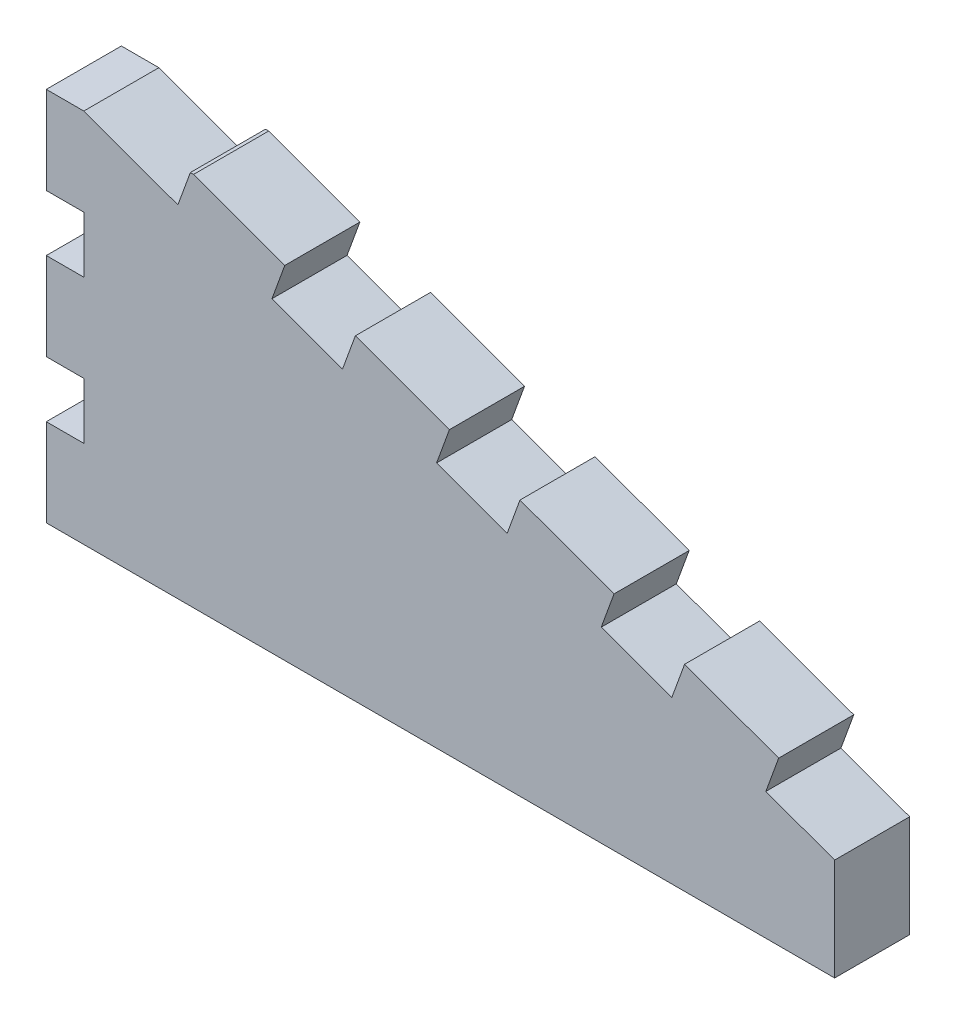
ISO-10303-21;
HEADER;
FILE_DESCRIPTION(('STEP AP214'),'2;1');
FILE_NAME('part.step','',(''),(''),'','','');
FILE_SCHEMA(('AUTOMOTIVE_DESIGN { 1 0 10303 214 1 1 1 1 }'));
ENDSEC;
DATA;
#1=APPLICATION_CONTEXT('core data for automotive mechanical design processes');
#2=APPLICATION_PROTOCOL_DEFINITION('international standard','automotive_design',2000,#1);
#3=PRODUCT_CONTEXT('',#1,'mechanical');
#4=PRODUCT('Part','Part','',(#3));
#5=PRODUCT_RELATED_PRODUCT_CATEGORY('part','',(#4));
#6=PRODUCT_DEFINITION_FORMATION('','',#4);
#7=PRODUCT_DEFINITION_CONTEXT('part definition',#1,'design');
#8=PRODUCT_DEFINITION('design','',#6,#7);
#9=PRODUCT_DEFINITION_SHAPE('','',#8);
#10=(LENGTH_UNIT() NAMED_UNIT(*) SI_UNIT(.MILLI.,.METRE.));
#11=(NAMED_UNIT(*) PLANE_ANGLE_UNIT() SI_UNIT($,.RADIAN.));
#12=(NAMED_UNIT(*) SI_UNIT($,.STERADIAN.) SOLID_ANGLE_UNIT());
#13=UNCERTAINTY_MEASURE_WITH_UNIT(LENGTH_MEASURE(1.E-05),#10,'distance_accuracy_value','');
#14=(GEOMETRIC_REPRESENTATION_CONTEXT(3) GLOBAL_UNCERTAINTY_ASSIGNED_CONTEXT((#13)) GLOBAL_UNIT_ASSIGNED_CONTEXT((#10,
#11,#12)) REPRESENTATION_CONTEXT('',''));
#15=CARTESIAN_POINT('',(0.,0.,0.));
#16=DIRECTION('',(0.,0.,1.));
#17=DIRECTION('',(1.,0.,0.));
#18=AXIS2_PLACEMENT_3D('',#15,#16,#17);
#19=CARTESIAN_POINT('',(0.,30.,6.));
#20=DIRECTION('',(0.,-1.,0.));
#21=DIRECTION('',(0.,0.,-1.));
#22=AXIS2_PLACEMENT_3D('',#19,#20,#21);
#23=PLANE('',#22);
#24=DIRECTION('',(-1.,0.,0.));
#25=VECTOR('',#24,1.);
#26=CARTESIAN_POINT('',(0.,30.,0.));
#27=LINE('',#26,#25);
#28=CARTESIAN_POINT('',(-60.,30.,0.));
#29=VERTEX_POINT('',#28);
#30=CARTESIAN_POINT('',(-63.,30.,0.));
#31=VERTEX_POINT('',#30);
#32=EDGE_CURVE('E267',#29,#31,#27,.T.);
#33=ORIENTED_EDGE('',*,*,#32,.T.);
#34=DIRECTION('',(0.,0.,-1.));
#35=VECTOR('',#34,1.);
#36=CARTESIAN_POINT('',(-63.,30.,6.));
#37=LINE('',#36,#35);
#38=CARTESIAN_POINT('',(-63.,30.,6.));
#39=VERTEX_POINT('',#38);
#40=EDGE_CURVE('E11',#39,#31,#37,.T.);
#41=ORIENTED_EDGE('',*,*,#40,.F.);
#42=DIRECTION('',(-1.,0.,0.));
#43=VECTOR('',#42,1.);
#44=CARTESIAN_POINT('',(0.,30.,6.));
#45=LINE('',#44,#43);
#46=CARTESIAN_POINT('',(-60.,30.,6.));
#47=VERTEX_POINT('',#46);
#48=EDGE_CURVE('E417',#47,#39,#45,.T.);
#49=ORIENTED_EDGE('',*,*,#48,.F.);
#50=DIRECTION('',(0.,0.,-1.));
#51=VECTOR('',#50,1.);
#52=CARTESIAN_POINT('',(-60.,30.,6.));
#53=LINE('',#52,#51);
#54=EDGE_CURVE('E53',#47,#29,#53,.T.);
#55=ORIENTED_EDGE('',*,*,#54,.T.);
#56=EDGE_LOOP('',(#33,#41,#49,#55));
#57=FACE_BOUND('',#56,.T.);
#58=ADVANCED_FACE('F37',(#57),#23,.F.);
#59=CARTESIAN_POINT('',(-63.,-1.2490009027033E-13,6.));
#60=DIRECTION('',(1.,0.,0.));
#61=DIRECTION('',(0.,1.,0.));
#62=AXIS2_PLACEMENT_3D('',#59,#60,#61);
#63=PLANE('',#62);
#64=DIRECTION('',(0.,-1.,0.));
#65=VECTOR('',#64,1.);
#66=CARTESIAN_POINT('',(-63.,-1.2490009027033E-13,0.));
#67=LINE('',#66,#65);
#68=CARTESIAN_POINT('',(-63.,23.,0.));
#69=VERTEX_POINT('',#68);
#70=EDGE_CURVE('E269',#31,#69,#67,.T.);
#71=ORIENTED_EDGE('',*,*,#70,.T.);
#72=DIRECTION('',(0.,0.,-1.));
#73=VECTOR('',#72,1.);
#74=CARTESIAN_POINT('',(-63.,23.,6.));
#75=LINE('',#74,#73);
#76=CARTESIAN_POINT('',(-63.,23.,6.));
#77=VERTEX_POINT('',#76);
#78=EDGE_CURVE('E45',#77,#69,#75,.T.);
#79=ORIENTED_EDGE('',*,*,#78,.F.);
#80=DIRECTION('',(0.,-1.,0.));
#81=VECTOR('',#80,1.);
#82=CARTESIAN_POINT('',(-63.,-1.2490009027033E-13,6.));
#83=LINE('',#82,#81);
#84=EDGE_CURVE('E157',#39,#77,#83,.T.);
#85=ORIENTED_EDGE('',*,*,#84,.F.);
#86=ORIENTED_EDGE('',*,*,#40,.T.);
#87=EDGE_LOOP('',(#71,#79,#85,#86));
#88=FACE_BOUND('',#87,.T.);
#89=ADVANCED_FACE('F399',(#88),#63,.F.);
#90=CARTESIAN_POINT('',(0.,23.,6.));
#91=DIRECTION('',(0.,-1.,0.));
#92=DIRECTION('',(0.,0.,-1.));
#93=AXIS2_PLACEMENT_3D('',#90,#91,#92);
#94=PLANE('',#93);
#95=DIRECTION('',(-1.,0.,0.));
#96=VECTOR('',#95,1.);
#97=CARTESIAN_POINT('',(0.,23.,0.));
#98=LINE('',#97,#96);
#99=CARTESIAN_POINT('',(-60.,23.,0.));
#100=VERTEX_POINT('',#99);
#101=EDGE_CURVE('E272',#100,#69,#98,.T.);
#102=ORIENTED_EDGE('',*,*,#101,.F.);
#103=DIRECTION('',(0.,0.,-1.));
#104=VECTOR('',#103,1.);
#105=CARTESIAN_POINT('',(-60.,23.,6.));
#106=LINE('',#105,#104);
#107=CARTESIAN_POINT('',(-60.,23.,6.));
#108=VERTEX_POINT('',#107);
#109=EDGE_CURVE('E392',#108,#100,#106,.T.);
#110=ORIENTED_EDGE('',*,*,#109,.F.);
#111=DIRECTION('',(-1.,0.,0.));
#112=VECTOR('',#111,1.);
#113=CARTESIAN_POINT('',(0.,23.,6.));
#114=LINE('',#113,#112);
#115=EDGE_CURVE('E398',#108,#77,#114,.T.);
#116=ORIENTED_EDGE('',*,*,#115,.T.);
#117=ORIENTED_EDGE('',*,*,#78,.T.);
#118=EDGE_LOOP('',(#102,#110,#116,#117));
#119=FACE_BOUND('',#118,.T.);
#120=ADVANCED_FACE('F396',(#119),#94,.T.);
#121=CARTESIAN_POINT('',(-60.,0.,6.));
#122=DIRECTION('',(-1.,0.,0.));
#123=DIRECTION('',(0.,0.,1.));
#124=AXIS2_PLACEMENT_3D('',#121,#122,#123);
#125=PLANE('',#124);
#126=DIRECTION('',(0.,1.,0.));
#127=VECTOR('',#126,1.);
#128=CARTESIAN_POINT('',(-60.,0.,0.));
#129=LINE('',#128,#127);
#130=CARTESIAN_POINT('',(-60.,18.5,0.));
#131=VERTEX_POINT('',#130);
#132=EDGE_CURVE('E275',#131,#100,#129,.T.);
#133=ORIENTED_EDGE('',*,*,#132,.F.);
#134=DIRECTION('',(0.,0.,-1.));
#135=VECTOR('',#134,1.);
#136=CARTESIAN_POINT('',(-60.,18.5,6.));
#137=LINE('',#136,#135);
#138=CARTESIAN_POINT('',(-60.,18.5,6.));
#139=VERTEX_POINT('',#138);
#140=EDGE_CURVE('E390',#139,#131,#137,.T.);
#141=ORIENTED_EDGE('',*,*,#140,.F.);
#142=DIRECTION('',(0.,1.,0.));
#143=VECTOR('',#142,1.);
#144=CARTESIAN_POINT('',(-60.,0.,6.));
#145=LINE('',#144,#143);
#146=EDGE_CURVE('E410',#139,#108,#145,.T.);
#147=ORIENTED_EDGE('',*,*,#146,.T.);
#148=ORIENTED_EDGE('',*,*,#109,.T.);
#149=EDGE_LOOP('',(#133,#141,#147,#148));
#150=FACE_BOUND('',#149,.T.);
#151=ADVANCED_FACE('F407',(#150),#125,.T.);
#152=CARTESIAN_POINT('',(0.,18.5,6.));
#153=DIRECTION('',(0.,1.,0.));
#154=DIRECTION('',(0.,0.,1.));
#155=AXIS2_PLACEMENT_3D('',#152,#153,#154);
#156=PLANE('',#155);
#157=DIRECTION('',(1.,0.,0.));
#158=VECTOR('',#157,1.);
#159=CARTESIAN_POINT('',(0.,18.5,0.));
#160=LINE('',#159,#158);
#161=CARTESIAN_POINT('',(-63.,18.5,0.));
#162=VERTEX_POINT('',#161);
#163=EDGE_CURVE('E278',#162,#131,#160,.T.);
#164=ORIENTED_EDGE('',*,*,#163,.F.);
#165=DIRECTION('',(0.,0.,-1.));
#166=VECTOR('',#165,1.);
#167=CARTESIAN_POINT('',(-63.,18.5,6.));
#168=LINE('',#167,#166);
#169=CARTESIAN_POINT('',(-63.,18.5,6.));
#170=VERTEX_POINT('',#169);
#171=EDGE_CURVE('E388',#170,#162,#168,.T.);
#172=ORIENTED_EDGE('',*,*,#171,.F.);
#173=DIRECTION('',(1.,0.,0.));
#174=VECTOR('',#173,1.);
#175=CARTESIAN_POINT('',(0.,18.5,6.));
#176=LINE('',#175,#174);
#177=EDGE_CURVE('E414',#170,#139,#176,.T.);
#178=ORIENTED_EDGE('',*,*,#177,.T.);
#179=ORIENTED_EDGE('',*,*,#140,.T.);
#180=EDGE_LOOP('',(#164,#172,#178,#179));
#181=FACE_BOUND('',#180,.T.);
#182=ADVANCED_FACE('F530',(#181),#156,.T.);
#183=CARTESIAN_POINT('',(-63.,0.,6.));
#184=DIRECTION('',(1.,0.,0.));
#185=DIRECTION('',(0.,0.,-1.));
#186=AXIS2_PLACEMENT_3D('',#183,#184,#185);
#187=PLANE('',#186);
#188=DIRECTION('',(0.,-1.,0.));
#189=VECTOR('',#188,1.);
#190=CARTESIAN_POINT('',(-63.,0.,0.));
#191=LINE('',#190,#189);
#192=CARTESIAN_POINT('',(-63.,11.5,0.));
#193=VERTEX_POINT('',#192);
#194=EDGE_CURVE('E282',#162,#193,#191,.T.);
#195=ORIENTED_EDGE('',*,*,#194,.T.);
#196=DIRECTION('',(0.,0.,-1.));
#197=VECTOR('',#196,1.);
#198=CARTESIAN_POINT('',(-63.,11.5,6.));
#199=LINE('',#198,#197);
#200=CARTESIAN_POINT('',(-63.,11.5,6.));
#201=VERTEX_POINT('',#200);
#202=EDGE_CURVE('E386',#201,#193,#199,.T.);
#203=ORIENTED_EDGE('',*,*,#202,.F.);
#204=DIRECTION('',(0.,-1.,0.));
#205=VECTOR('',#204,1.);
#206=CARTESIAN_POINT('',(-63.,0.,6.));
#207=LINE('',#206,#205);
#208=EDGE_CURVE('E422',#170,#201,#207,.T.);
#209=ORIENTED_EDGE('',*,*,#208,.F.);
#210=ORIENTED_EDGE('',*,*,#171,.T.);
#211=EDGE_LOOP('',(#195,#203,#209,#210));
#212=FACE_BOUND('',#211,.T.);
#213=ADVANCED_FACE('F532',(#212),#187,.F.);
#214=CARTESIAN_POINT('',(0.,11.5,6.));
#215=DIRECTION('',(0.,-1.,0.));
#216=DIRECTION('',(1.,0.,0.));
#217=AXIS2_PLACEMENT_3D('',#214,#215,#216);
#218=PLANE('',#217);
#219=DIRECTION('',(-1.,0.,0.));
#220=VECTOR('',#219,1.);
#221=CARTESIAN_POINT('',(0.,11.5,0.));
#222=LINE('',#221,#220);
#223=CARTESIAN_POINT('',(-60.,11.5,0.));
#224=VERTEX_POINT('',#223);
#225=EDGE_CURVE('E285',#224,#193,#222,.T.);
#226=ORIENTED_EDGE('',*,*,#225,.F.);
#227=DIRECTION('',(0.,0.,-1.));
#228=VECTOR('',#227,1.);
#229=CARTESIAN_POINT('',(-60.,11.5,6.));
#230=LINE('',#229,#228);
#231=CARTESIAN_POINT('',(-60.,11.5,6.));
#232=VERTEX_POINT('',#231);
#233=EDGE_CURVE('E384',#232,#224,#230,.T.);
#234=ORIENTED_EDGE('',*,*,#233,.F.);
#235=DIRECTION('',(-1.,0.,0.));
#236=VECTOR('',#235,1.);
#237=CARTESIAN_POINT('',(0.,11.5,6.));
#238=LINE('',#237,#236);
#239=EDGE_CURVE('E424',#232,#201,#238,.T.);
#240=ORIENTED_EDGE('',*,*,#239,.T.);
#241=ORIENTED_EDGE('',*,*,#202,.T.);
#242=EDGE_LOOP('',(#226,#234,#240,#241));
#243=FACE_BOUND('',#242,.T.);
#244=ADVANCED_FACE('F526',(#243),#218,.T.);
#245=CARTESIAN_POINT('',(-60.,6.99999999999999,0.));
#246=VERTEX_POINT('',#245);
#247=EDGE_CURVE('E279',#246,#224,#129,.T.);
#248=ORIENTED_EDGE('',*,*,#247,.F.);
#249=DIRECTION('',(0.,0.,-1.));
#250=VECTOR('',#249,1.);
#251=CARTESIAN_POINT('',(-60.,6.99999999999999,6.));
#252=LINE('',#251,#250);
#253=CARTESIAN_POINT('',(-60.,6.99999999999999,6.));
#254=VERTEX_POINT('',#253);
#255=EDGE_CURVE('E382',#254,#246,#252,.T.);
#256=ORIENTED_EDGE('',*,*,#255,.F.);
#257=EDGE_CURVE('E416',#254,#232,#145,.T.);
#258=ORIENTED_EDGE('',*,*,#257,.T.);
#259=ORIENTED_EDGE('',*,*,#233,.T.);
#260=EDGE_LOOP('',(#248,#256,#258,#259));
#261=FACE_BOUND('',#260,.T.);
#262=ADVANCED_FACE('F519',(#261),#125,.T.);
#263=CARTESIAN_POINT('',(0.,7.00000000000001,6.));
#264=DIRECTION('',(0.,-1.,0.));
#265=DIRECTION('',(1.,0.,0.));
#266=AXIS2_PLACEMENT_3D('',#263,#264,#265);
#267=PLANE('',#266);
#268=DIRECTION('',(-1.,0.,0.));
#269=VECTOR('',#268,1.);
#270=CARTESIAN_POINT('',(0.,7.00000000000001,0.));
#271=LINE('',#270,#269);
#272=CARTESIAN_POINT('',(-63.,6.99999999999999,0.));
#273=VERTEX_POINT('',#272);
#274=EDGE_CURVE('E288',#246,#273,#271,.T.);
#275=ORIENTED_EDGE('',*,*,#274,.T.);
#276=DIRECTION('',(0.,0.,-1.));
#277=VECTOR('',#276,1.);
#278=CARTESIAN_POINT('',(-63.,6.99999999999999,6.));
#279=LINE('',#278,#277);
#280=CARTESIAN_POINT('',(-63.,6.99999999999999,6.));
#281=VERTEX_POINT('',#280);
#282=EDGE_CURVE('E380',#281,#273,#279,.T.);
#283=ORIENTED_EDGE('',*,*,#282,.F.);
#284=DIRECTION('',(-1.,0.,0.));
#285=VECTOR('',#284,1.);
#286=CARTESIAN_POINT('',(0.,7.00000000000001,6.));
#287=LINE('',#286,#285);
#288=EDGE_CURVE('E427',#254,#281,#287,.T.);
#289=ORIENTED_EDGE('',*,*,#288,.F.);
#290=ORIENTED_EDGE('',*,*,#255,.T.);
#291=EDGE_LOOP('',(#275,#283,#289,#290));
#292=FACE_BOUND('',#291,.T.);
#293=ADVANCED_FACE('F608',(#292),#267,.F.);
#294=CARTESIAN_POINT('',(-63.,0.,6.));
#295=DIRECTION('',(-1.,0.,0.));
#296=DIRECTION('',(0.,0.,1.));
#297=AXIS2_PLACEMENT_3D('',#294,#295,#296);
#298=PLANE('',#297);
#299=DIRECTION('',(0.,1.,0.));
#300=VECTOR('',#299,1.);
#301=CARTESIAN_POINT('',(-63.,0.,0.));
#302=LINE('',#301,#300);
#303=CARTESIAN_POINT('',(-63.,0.,0.));
#304=VERTEX_POINT('',#303);
#305=EDGE_CURVE('E291',#304,#273,#302,.T.);
#306=ORIENTED_EDGE('',*,*,#305,.F.);
#307=DIRECTION('',(0.,0.,-1.));
#308=VECTOR('',#307,1.);
#309=CARTESIAN_POINT('',(-63.,0.,6.));
#310=LINE('',#309,#308);
#311=CARTESIAN_POINT('',(-63.,0.,6.));
#312=VERTEX_POINT('',#311);
#313=EDGE_CURVE('E378',#312,#304,#310,.T.);
#314=ORIENTED_EDGE('',*,*,#313,.F.);
#315=DIRECTION('',(0.,1.,0.));
#316=VECTOR('',#315,1.);
#317=CARTESIAN_POINT('',(-63.,0.,6.));
#318=LINE('',#317,#316);
#319=EDGE_CURVE('E429',#312,#281,#318,.T.);
#320=ORIENTED_EDGE('',*,*,#319,.T.);
#321=ORIENTED_EDGE('',*,*,#282,.T.);
#322=EDGE_LOOP('',(#306,#314,#320,#321));
#323=FACE_BOUND('',#322,.T.);
#324=ADVANCED_FACE('F512',(#323),#298,.T.);
#325=CARTESIAN_POINT('',(0.,0.,6.));
#326=DIRECTION('',(0.,-1.,0.));
#327=DIRECTION('',(1.,0.,0.));
#328=AXIS2_PLACEMENT_3D('',#325,#326,#327);
#329=PLANE('',#328);
#330=DIRECTION('',(-1.,0.,0.));
#331=VECTOR('',#330,1.);
#332=CARTESIAN_POINT('',(0.,0.,0.));
#333=LINE('',#332,#331);
#334=CARTESIAN_POINT('',(0.,0.,0.));
#335=VERTEX_POINT('',#334);
#336=EDGE_CURVE('E294',#335,#304,#333,.T.);
#337=ORIENTED_EDGE('',*,*,#336,.F.);
#338=DIRECTION('',(0.,0.,-1.));
#339=VECTOR('',#338,1.);
#340=CARTESIAN_POINT('',(0.,0.,6.));
#341=LINE('',#340,#339);
#342=CARTESIAN_POINT('',(0.,0.,6.));
#343=VERTEX_POINT('',#342);
#344=EDGE_CURVE('E376',#343,#335,#341,.T.);
#345=ORIENTED_EDGE('',*,*,#344,.F.);
#346=DIRECTION('',(-1.,0.,0.));
#347=VECTOR('',#346,1.);
#348=CARTESIAN_POINT('',(0.,0.,6.));
#349=LINE('',#348,#347);
#350=EDGE_CURVE('E432',#343,#312,#349,.T.);
#351=ORIENTED_EDGE('',*,*,#350,.T.);
#352=ORIENTED_EDGE('',*,*,#313,.T.);
#353=EDGE_LOOP('',(#337,#345,#351,#352));
#354=FACE_BOUND('',#353,.T.);
#355=ADVANCED_FACE('F507',(#354),#329,.T.);
#356=CARTESIAN_POINT('',(0.,0.,6.));
#357=DIRECTION('',(-1.,0.,0.));
#358=DIRECTION('',(0.,0.,1.));
#359=AXIS2_PLACEMENT_3D('',#356,#357,#358);
#360=PLANE('',#359);
#361=DIRECTION('',(0.,1.,0.));
#362=VECTOR('',#361,1.);
#363=CARTESIAN_POINT('',(0.,0.,0.));
#364=LINE('',#363,#362);
#365=CARTESIAN_POINT('',(0.,8.16178594402829,0.));
#366=VERTEX_POINT('',#365);
#367=EDGE_CURVE('E297',#335,#366,#364,.T.);
#368=ORIENTED_EDGE('',*,*,#367,.T.);
#369=DIRECTION('',(0.,0.,-1.));
#370=VECTOR('',#369,1.);
#371=CARTESIAN_POINT('',(0.,8.16178594402829,6.));
#372=LINE('',#371,#370);
#373=CARTESIAN_POINT('',(0.,8.16178594402829,6.));
#374=VERTEX_POINT('',#373);
#375=EDGE_CURVE('E374',#374,#366,#372,.T.);
#376=ORIENTED_EDGE('',*,*,#375,.F.);
#377=DIRECTION('',(0.,1.,0.));
#378=VECTOR('',#377,1.);
#379=CARTESIAN_POINT('',(0.,0.,6.));
#380=LINE('',#379,#378);
#381=EDGE_CURVE('E435',#343,#374,#380,.T.);
#382=ORIENTED_EDGE('',*,*,#381,.F.);
#383=ORIENTED_EDGE('',*,*,#344,.T.);
#384=EDGE_LOOP('',(#368,#376,#382,#383));
#385=FACE_BOUND('',#384,.T.);
#386=ADVANCED_FACE('F504',(#385),#360,.F.);
#387=CARTESIAN_POINT('',(2.62314743886753,7.2070383561889,6.));
#388=DIRECTION('',(0.342020143325663,0.939692620785911,0.));
#389=DIRECTION('',(-0.939692620785911,0.342020143325663,0.));
#390=AXIS2_PLACEMENT_3D('',#387,#388,#389);
#391=PLANE('',#390);
#392=DIRECTION('',(0.939692620785911,-0.342020143325663,0.));
#393=VECTOR('',#392,1.);
#394=CARTESIAN_POINT('',(2.62314743886753,7.2070383561889,0.));
#395=LINE('',#394,#393);
#396=CARTESIAN_POINT('',(-5.49782799441718,10.1628316871116,0.));
#397=VERTEX_POINT('',#396);
#398=EDGE_CURVE('E300',#397,#366,#395,.T.);
#399=ORIENTED_EDGE('',*,*,#398,.F.);
#400=DIRECTION('',(0.,0.,-1.));
#401=VECTOR('',#400,1.);
#402=CARTESIAN_POINT('',(-5.49782799441718,10.1628316871116,6.));
#403=LINE('',#402,#401);
#404=CARTESIAN_POINT('',(-5.49782799441718,10.1628316871116,6.));
#405=VERTEX_POINT('',#404);
#406=EDGE_CURVE('E372',#405,#397,#403,.T.);
#407=ORIENTED_EDGE('',*,*,#406,.F.);
#408=DIRECTION('',(0.939692620785911,-0.342020143325663,0.));
#409=VECTOR('',#408,1.);
#410=CARTESIAN_POINT('',(2.62314743886753,7.2070383561889,6.));
#411=LINE('',#410,#409);
#412=EDGE_CURVE('E264',#405,#374,#411,.T.);
#413=ORIENTED_EDGE('',*,*,#412,.T.);
#414=ORIENTED_EDGE('',*,*,#375,.T.);
#415=EDGE_LOOP('',(#399,#407,#413,#414));
#416=FACE_BOUND('',#415,.T.);
#417=ADVANCED_FACE('F498',(#416),#391,.T.);
#418=CARTESIAN_POINT('',(-8.12097543328471,2.95579333092265,6.));
#419=DIRECTION('',(-0.939692620785911,0.342020143325663,0.));
#420=DIRECTION('',(-0.342020143325663,-0.939692620785911,0.));
#421=AXIS2_PLACEMENT_3D('',#418,#419,#420);
#422=PLANE('',#421);
#423=DIRECTION('',(0.342020143325663,0.939692620785911,0.));
#424=VECTOR('',#423,1.);
#425=CARTESIAN_POINT('',(-8.12097543328471,2.95579333092265,0.));
#426=LINE('',#425,#424);
#427=CARTESIAN_POINT('',(-4.47176756444019,12.9819095494693,0.));
#428=VERTEX_POINT('',#427);
#429=EDGE_CURVE('E303',#397,#428,#426,.T.);
#430=ORIENTED_EDGE('',*,*,#429,.T.);
#431=DIRECTION('',(0.,0.,-1.));
#432=VECTOR('',#431,1.);
#433=CARTESIAN_POINT('',(-4.47176756444019,12.9819095494693,6.));
#434=LINE('',#433,#432);
#435=CARTESIAN_POINT('',(-4.47176756444019,12.9819095494693,6.));
#436=VERTEX_POINT('',#435);
#437=EDGE_CURVE('E370',#436,#428,#434,.T.);
#438=ORIENTED_EDGE('',*,*,#437,.F.);
#439=DIRECTION('',(0.342020143325663,0.939692620785911,0.));
#440=VECTOR('',#439,1.);
#441=CARTESIAN_POINT('',(-8.12097543328471,2.95579333092265,6.));
#442=LINE('',#441,#440);
#443=EDGE_CURVE('E438',#405,#436,#442,.T.);
#444=ORIENTED_EDGE('',*,*,#443,.F.);
#445=ORIENTED_EDGE('',*,*,#406,.T.);
#446=EDGE_LOOP('',(#430,#438,#444,#445));
#447=FACE_BOUND('',#446,.T.);
#448=ADVANCED_FACE('F557',(#447),#422,.F.);
#449=CARTESIAN_POINT('',(3.64920786884452,10.0261162185466,6.));
#450=DIRECTION('',(0.342020143325663,0.93969262078591,0.));
#451=DIRECTION('',(-0.939692620785911,0.342020143325663,0.));
#452=AXIS2_PLACEMENT_3D('',#449,#450,#451);
#453=PLANE('',#452);
#454=DIRECTION('',(0.939692620785911,-0.342020143325663,0.));
#455=VECTOR('',#454,1.);
#456=CARTESIAN_POINT('',(3.64920786884452,10.0261162185466,0.));
#457=LINE('',#456,#455);
#458=CARTESIAN_POINT('',(-11.9893085307275,15.7180706960746,0.));
#459=VERTEX_POINT('',#458);
#460=EDGE_CURVE('E308',#459,#428,#457,.T.);
#461=ORIENTED_EDGE('',*,*,#460,.F.);
#462=DIRECTION('',(0.,0.,-1.));
#463=VECTOR('',#462,1.);
#464=CARTESIAN_POINT('',(-11.9893085307275,15.7180706960746,6.));
#465=LINE('',#464,#463);
#466=CARTESIAN_POINT('',(-11.9893085307275,15.7180706960746,6.));
#467=VERTEX_POINT('',#466);
#468=EDGE_CURVE('E368',#467,#459,#465,.T.);
#469=ORIENTED_EDGE('',*,*,#468,.F.);
#470=DIRECTION('',(0.939692620785911,-0.342020143325663,0.));
#471=VECTOR('',#470,1.);
#472=CARTESIAN_POINT('',(3.64920786884452,10.0261162185466,6.));
#473=LINE('',#472,#471);
#474=EDGE_CURVE('E441',#467,#436,#473,.T.);
#475=ORIENTED_EDGE('',*,*,#474,.T.);
#476=ORIENTED_EDGE('',*,*,#437,.T.);
#477=EDGE_LOOP('',(#461,#469,#475,#476));
#478=FACE_BOUND('',#477,.T.);
#479=ADVANCED_FACE('F491',(#478),#453,.T.);
#480=CARTESIAN_POINT('',(-15.638516399572,5.69195447752794,6.));
#481=DIRECTION('',(-0.939692620785911,0.342020143325662,0.));
#482=DIRECTION('',(-0.342020143325662,-0.939692620785911,0.));
#483=AXIS2_PLACEMENT_3D('',#480,#481,#482);
#484=PLANE('',#483);
#485=DIRECTION('',(0.342020143325662,0.939692620785911,0.));
#486=VECTOR('',#485,1.);
#487=CARTESIAN_POINT('',(-15.638516399572,5.69195447752794,0.));
#488=LINE('',#487,#486);
#489=CARTESIAN_POINT('',(-13.0153689607045,12.8989928337169,0.));
#490=VERTEX_POINT('',#489);
#491=EDGE_CURVE('E311',#490,#459,#488,.T.);
#492=ORIENTED_EDGE('',*,*,#491,.F.);
#493=DIRECTION('',(0.,0.,-1.));
#494=VECTOR('',#493,1.);
#495=CARTESIAN_POINT('',(-13.0153689607045,12.8989928337169,6.));
#496=LINE('',#495,#494);
#497=CARTESIAN_POINT('',(-13.0153689607045,12.8989928337169,6.));
#498=VERTEX_POINT('',#497);
#499=EDGE_CURVE('E366',#498,#490,#496,.T.);
#500=ORIENTED_EDGE('',*,*,#499,.F.);
#501=DIRECTION('',(0.342020143325662,0.939692620785911,0.));
#502=VECTOR('',#501,1.);
#503=CARTESIAN_POINT('',(-15.638516399572,5.69195447752794,6.));
#504=LINE('',#503,#502);
#505=EDGE_CURVE('E444',#498,#467,#504,.T.);
#506=ORIENTED_EDGE('',*,*,#505,.T.);
#507=ORIENTED_EDGE('',*,*,#468,.T.);
#508=EDGE_LOOP('',(#492,#500,#506,#507));
#509=FACE_BOUND('',#508,.T.);
#510=ADVANCED_FACE('F487',(#509),#484,.T.);
#511=CARTESIAN_POINT('',(-18.6535246854199,14.9511136936708,0.));
#512=VERTEX_POINT('',#511);
#513=EDGE_CURVE('E305',#512,#490,#395,.T.);
#514=ORIENTED_EDGE('',*,*,#513,.F.);
#515=DIRECTION('',(0.,0.,-1.));
#516=VECTOR('',#515,1.);
#517=CARTESIAN_POINT('',(-18.6535246854199,14.9511136936708,6.));
#518=LINE('',#517,#516);
#519=CARTESIAN_POINT('',(-18.6535246854199,14.9511136936708,6.));
#520=VERTEX_POINT('',#519);
#521=EDGE_CURVE('E364',#520,#512,#518,.T.);
#522=ORIENTED_EDGE('',*,*,#521,.F.);
#523=EDGE_CURVE('E439',#520,#498,#411,.T.);
#524=ORIENTED_EDGE('',*,*,#523,.T.);
#525=ORIENTED_EDGE('',*,*,#499,.T.);
#526=EDGE_LOOP('',(#514,#522,#524,#525));
#527=FACE_BOUND('',#526,.T.);
#528=ADVANCED_FACE('F481',(#527),#391,.T.);
#529=CARTESIAN_POINT('',(-21.2766721242875,7.74407533748193,6.));
#530=DIRECTION('',(-0.939692620785911,0.342020143325663,0.));
#531=DIRECTION('',(-0.342020143325663,-0.939692620785911,0.));
#532=AXIS2_PLACEMENT_3D('',#529,#530,#531);
#533=PLANE('',#532);
#534=DIRECTION('',(0.342020143325663,0.939692620785911,0.));
#535=VECTOR('',#534,1.);
#536=CARTESIAN_POINT('',(-21.2766721242875,7.74407533748193,0.));
#537=LINE('',#536,#535);
#538=CARTESIAN_POINT('',(-17.6274642554429,17.7701915560286,0.));
#539=VERTEX_POINT('',#538);
#540=EDGE_CURVE('E314',#512,#539,#537,.T.);
#541=ORIENTED_EDGE('',*,*,#540,.T.);
#542=DIRECTION('',(0.,0.,-1.));
#543=VECTOR('',#542,1.);
#544=CARTESIAN_POINT('',(-17.6274642554429,17.7701915560286,6.));
#545=LINE('',#544,#543);
#546=CARTESIAN_POINT('',(-17.6274642554429,17.7701915560286,6.));
#547=VERTEX_POINT('',#546);
#548=EDGE_CURVE('E362',#547,#539,#545,.T.);
#549=ORIENTED_EDGE('',*,*,#548,.F.);
#550=DIRECTION('',(0.342020143325663,0.939692620785911,0.));
#551=VECTOR('',#550,1.);
#552=CARTESIAN_POINT('',(-21.2766721242875,7.74407533748193,6.));
#553=LINE('',#552,#551);
#554=EDGE_CURVE('E447',#520,#547,#553,.T.);
#555=ORIENTED_EDGE('',*,*,#554,.F.);
#556=ORIENTED_EDGE('',*,*,#521,.T.);
#557=EDGE_LOOP('',(#541,#549,#555,#556));
#558=FACE_BOUND('',#557,.T.);
#559=ADVANCED_FACE('F586',(#558),#533,.F.);
#560=CARTESIAN_POINT('',(3.64920786884452,10.0261162185467,6.));
#561=DIRECTION('',(0.342020143325662,0.939692620785911,0.));
#562=DIRECTION('',(-0.939692620785911,0.342020143325662,0.));
#563=AXIS2_PLACEMENT_3D('',#560,#561,#562);
#564=PLANE('',#563);
#565=DIRECTION('',(0.939692620785911,-0.342020143325662,0.));
#566=VECTOR('',#565,1.);
#567=CARTESIAN_POINT('',(3.64920786884452,10.0261162185467,0.));
#568=LINE('',#567,#566);
#569=CARTESIAN_POINT('',(-25.1450052217302,20.5063527026339,0.));
#570=VERTEX_POINT('',#569);
#571=EDGE_CURVE('E317',#570,#539,#568,.T.);
#572=ORIENTED_EDGE('',*,*,#571,.F.);
#573=DIRECTION('',(0.,0.,-1.));
#574=VECTOR('',#573,1.);
#575=CARTESIAN_POINT('',(-25.1450052217302,20.5063527026339,6.));
#576=LINE('',#575,#574);
#577=CARTESIAN_POINT('',(-25.1450052217302,20.5063527026339,6.));
#578=VERTEX_POINT('',#577);
#579=EDGE_CURVE('E360',#578,#570,#576,.T.);
#580=ORIENTED_EDGE('',*,*,#579,.F.);
#581=DIRECTION('',(0.939692620785911,-0.342020143325662,0.));
#582=VECTOR('',#581,1.);
#583=CARTESIAN_POINT('',(3.64920786884452,10.0261162185467,6.));
#584=LINE('',#583,#582);
#585=EDGE_CURVE('E449',#578,#547,#584,.T.);
#586=ORIENTED_EDGE('',*,*,#585,.T.);
#587=ORIENTED_EDGE('',*,*,#548,.T.);
#588=EDGE_LOOP('',(#572,#580,#586,#587));
#589=FACE_BOUND('',#588,.T.);
#590=ADVANCED_FACE('F582',(#589),#564,.T.);
#591=CARTESIAN_POINT('',(-28.7942130905747,10.4802364840872,6.));
#592=DIRECTION('',(-0.939692620785911,0.342020143325662,0.));
#593=DIRECTION('',(-0.342020143325662,-0.939692620785911,0.));
#594=AXIS2_PLACEMENT_3D('',#591,#592,#593);
#595=PLANE('',#594);
#596=DIRECTION('',(0.342020143325662,0.939692620785911,0.));
#597=VECTOR('',#596,1.);
#598=CARTESIAN_POINT('',(-28.7942130905747,10.4802364840872,0.));
#599=LINE('',#598,#597);
#600=CARTESIAN_POINT('',(-26.1710656517072,17.6872748402761,0.));
#601=VERTEX_POINT('',#600);
#602=EDGE_CURVE('E320',#601,#570,#599,.T.);
#603=ORIENTED_EDGE('',*,*,#602,.F.);
#604=DIRECTION('',(0.,0.,-1.));
#605=VECTOR('',#604,1.);
#606=CARTESIAN_POINT('',(-26.1710656517072,17.6872748402761,6.));
#607=LINE('',#606,#605);
#608=CARTESIAN_POINT('',(-26.1710656517072,17.6872748402761,6.));
#609=VERTEX_POINT('',#608);
#610=EDGE_CURVE('E358',#609,#601,#607,.T.);
#611=ORIENTED_EDGE('',*,*,#610,.F.);
#612=DIRECTION('',(0.342020143325662,0.939692620785911,0.));
#613=VECTOR('',#612,1.);
#614=CARTESIAN_POINT('',(-28.7942130905747,10.4802364840872,6.));
#615=LINE('',#614,#613);
#616=EDGE_CURVE('E452',#609,#578,#615,.T.);
#617=ORIENTED_EDGE('',*,*,#616,.T.);
#618=ORIENTED_EDGE('',*,*,#579,.T.);
#619=EDGE_LOOP('',(#603,#611,#617,#618));
#620=FACE_BOUND('',#619,.T.);
#621=ADVANCED_FACE('F574',(#620),#595,.T.);
#622=CARTESIAN_POINT('',(-31.8092213764227,19.7393957002301,0.));
#623=VERTEX_POINT('',#622);
#624=EDGE_CURVE('E323',#623,#601,#395,.T.);
#625=ORIENTED_EDGE('',*,*,#624,.F.);
#626=DIRECTION('',(0.,0.,-1.));
#627=VECTOR('',#626,1.);
#628=CARTESIAN_POINT('',(-31.8092213764227,19.7393957002301,6.));
#629=LINE('',#628,#627);
#630=CARTESIAN_POINT('',(-31.8092213764227,19.7393957002301,6.));
#631=VERTEX_POINT('',#630);
#632=EDGE_CURVE('E356',#631,#623,#629,.T.);
#633=ORIENTED_EDGE('',*,*,#632,.F.);
#634=EDGE_CURVE('E455',#631,#609,#411,.T.);
#635=ORIENTED_EDGE('',*,*,#634,.T.);
#636=ORIENTED_EDGE('',*,*,#610,.T.);
#637=EDGE_LOOP('',(#625,#633,#635,#636));
#638=FACE_BOUND('',#637,.T.);
#639=ADVANCED_FACE('F562',(#638),#391,.T.);
#640=CARTESIAN_POINT('',(-34.4323688152902,12.5323573440412,6.));
#641=DIRECTION('',(-0.939692620785911,0.342020143325663,0.));
#642=DIRECTION('',(-0.342020143325663,-0.939692620785911,0.));
#643=AXIS2_PLACEMENT_3D('',#640,#641,#642);
#644=PLANE('',#643);
#645=DIRECTION('',(0.342020143325662,0.939692620785911,0.));
#646=VECTOR('',#645,1.);
#647=CARTESIAN_POINT('',(-34.4323688152902,12.5323573440412,0.));
#648=LINE('',#647,#646);
#649=CARTESIAN_POINT('',(-30.7831609464457,22.5584735625878,0.));
#650=VERTEX_POINT('',#649);
#651=EDGE_CURVE('E324',#623,#650,#648,.T.);
#652=ORIENTED_EDGE('',*,*,#651,.T.);
#653=DIRECTION('',(0.,0.,-1.));
#654=VECTOR('',#653,1.);
#655=CARTESIAN_POINT('',(-30.7831609464457,22.5584735625878,6.));
#656=LINE('',#655,#654);
#657=CARTESIAN_POINT('',(-30.7831609464457,22.5584735625878,6.));
#658=VERTEX_POINT('',#657);
#659=EDGE_CURVE('E354',#658,#650,#656,.T.);
#660=ORIENTED_EDGE('',*,*,#659,.F.);
#661=DIRECTION('',(0.342020143325662,0.939692620785911,0.));
#662=VECTOR('',#661,1.);
#663=CARTESIAN_POINT('',(-34.4323688152902,12.5323573440412,6.));
#664=LINE('',#663,#662);
#665=EDGE_CURVE('E456',#631,#658,#664,.T.);
#666=ORIENTED_EDGE('',*,*,#665,.F.);
#667=ORIENTED_EDGE('',*,*,#632,.T.);
#668=EDGE_LOOP('',(#652,#660,#666,#667));
#669=FACE_BOUND('',#668,.T.);
#670=ADVANCED_FACE('F573',(#669),#644,.F.);
#671=CARTESIAN_POINT('',(3.64920786884451,10.0261162185466,6.));
#672=DIRECTION('',(0.342020143325663,0.93969262078591,0.));
#673=DIRECTION('',(-0.93969262078591,0.342020143325663,0.));
#674=AXIS2_PLACEMENT_3D('',#671,#672,#673);
#675=PLANE('',#674);
#676=DIRECTION('',(0.939692620785911,-0.342020143325663,0.));
#677=VECTOR('',#676,1.);
#678=CARTESIAN_POINT('',(3.64920786884451,10.0261162185466,0.));
#679=LINE('',#678,#677);
#680=CARTESIAN_POINT('',(-38.300701912733,25.2946347091931,0.));
#681=VERTEX_POINT('',#680);
#682=EDGE_CURVE('E327',#681,#650,#679,.T.);
#683=ORIENTED_EDGE('',*,*,#682,.F.);
#684=DIRECTION('',(0.,0.,-1.));
#685=VECTOR('',#684,1.);
#686=CARTESIAN_POINT('',(-38.300701912733,25.2946347091931,6.));
#687=LINE('',#686,#685);
#688=CARTESIAN_POINT('',(-38.300701912733,25.2946347091931,6.));
#689=VERTEX_POINT('',#688);
#690=EDGE_CURVE('E352',#689,#681,#687,.T.);
#691=ORIENTED_EDGE('',*,*,#690,.F.);
#692=DIRECTION('',(0.939692620785911,-0.342020143325663,0.));
#693=VECTOR('',#692,1.);
#694=CARTESIAN_POINT('',(3.64920786884451,10.0261162185466,6.));
#695=LINE('',#694,#693);
#696=EDGE_CURVE('E458',#689,#658,#695,.T.);
#697=ORIENTED_EDGE('',*,*,#696,.T.);
#698=ORIENTED_EDGE('',*,*,#659,.T.);
#699=EDGE_LOOP('',(#683,#691,#697,#698));
#700=FACE_BOUND('',#699,.T.);
#701=ADVANCED_FACE('F569',(#700),#675,.T.);
#702=CARTESIAN_POINT('',(-41.9499097815775,15.2685184906465,6.));
#703=DIRECTION('',(-0.939692620785911,0.342020143325662,0.));
#704=DIRECTION('',(-0.342020143325662,-0.939692620785911,0.));
#705=AXIS2_PLACEMENT_3D('',#702,#703,#704);
#706=PLANE('',#705);
#707=DIRECTION('',(0.342020143325662,0.939692620785911,0.));
#708=VECTOR('',#707,1.);
#709=CARTESIAN_POINT('',(-41.9499097815775,15.2685184906465,0.));
#710=LINE('',#709,#708);
#711=CARTESIAN_POINT('',(-39.32676234271,22.4755568468354,0.));
#712=VERTEX_POINT('',#711);
#713=EDGE_CURVE('E330',#712,#681,#710,.T.);
#714=ORIENTED_EDGE('',*,*,#713,.F.);
#715=DIRECTION('',(0.,0.,-1.));
#716=VECTOR('',#715,1.);
#717=CARTESIAN_POINT('',(-39.32676234271,22.4755568468354,6.));
#718=LINE('',#717,#716);
#719=CARTESIAN_POINT('',(-39.32676234271,22.4755568468354,6.));
#720=VERTEX_POINT('',#719);
#721=EDGE_CURVE('E350',#720,#712,#718,.T.);
#722=ORIENTED_EDGE('',*,*,#721,.F.);
#723=DIRECTION('',(0.342020143325662,0.939692620785911,0.));
#724=VECTOR('',#723,1.);
#725=CARTESIAN_POINT('',(-41.9499097815775,15.2685184906465,6.));
#726=LINE('',#725,#724);
#727=EDGE_CURVE('E461',#720,#689,#726,.T.);
#728=ORIENTED_EDGE('',*,*,#727,.T.);
#729=ORIENTED_EDGE('',*,*,#690,.T.);
#730=EDGE_LOOP('',(#714,#722,#728,#729));
#731=FACE_BOUND('',#730,.T.);
#732=ADVANCED_FACE('F560',(#731),#706,.T.);
#733=CARTESIAN_POINT('',(-44.9649180674254,24.5276777067894,0.));
#734=VERTEX_POINT('',#733);
#735=EDGE_CURVE('E333',#734,#712,#395,.T.);
#736=ORIENTED_EDGE('',*,*,#735,.F.);
#737=DIRECTION('',(0.,0.,-1.));
#738=VECTOR('',#737,1.);
#739=CARTESIAN_POINT('',(-44.9649180674254,24.5276777067894,6.));
#740=LINE('',#739,#738);
#741=CARTESIAN_POINT('',(-44.9649180674254,24.5276777067894,6.));
#742=VERTEX_POINT('',#741);
#743=EDGE_CURVE('E348',#742,#734,#740,.T.);
#744=ORIENTED_EDGE('',*,*,#743,.F.);
#745=EDGE_CURVE('E263',#742,#720,#411,.T.);
#746=ORIENTED_EDGE('',*,*,#745,.T.);
#747=ORIENTED_EDGE('',*,*,#721,.T.);
#748=EDGE_LOOP('',(#736,#744,#746,#747));
#749=FACE_BOUND('',#748,.T.);
#750=ADVANCED_FACE('F548',(#749),#391,.T.);
#751=CARTESIAN_POINT('',(-47.5880655062929,17.3206393506006,6.));
#752=DIRECTION('',(-0.93969262078591,0.342020143325664,0.));
#753=DIRECTION('',(-0.342020143325664,-0.93969262078591,0.));
#754=AXIS2_PLACEMENT_3D('',#751,#752,#753);
#755=PLANE('',#754);
#756=DIRECTION('',(0.342020143325664,0.93969262078591,0.));
#757=VECTOR('',#756,1.);
#758=CARTESIAN_POINT('',(-47.5880655062929,17.3206393506006,0.));
#759=LINE('',#758,#757);
#760=CARTESIAN_POINT('',(-43.9388576374484,27.3467555691471,0.));
#761=VERTEX_POINT('',#760);
#762=EDGE_CURVE('E334',#734,#761,#759,.T.);
#763=ORIENTED_EDGE('',*,*,#762,.T.);
#764=DIRECTION('',(0.,0.,-1.));
#765=VECTOR('',#764,1.);
#766=CARTESIAN_POINT('',(-43.9388576374484,27.3467555691471,6.));
#767=LINE('',#766,#765);
#768=CARTESIAN_POINT('',(-43.9388576374484,27.3467555691471,6.));
#769=VERTEX_POINT('',#768);
#770=EDGE_CURVE('E346',#769,#761,#767,.T.);
#771=ORIENTED_EDGE('',*,*,#770,.F.);
#772=DIRECTION('',(0.342020143325664,0.93969262078591,0.));
#773=VECTOR('',#772,1.);
#774=CARTESIAN_POINT('',(-47.5880655062929,17.3206393506006,6.));
#775=LINE('',#774,#773);
#776=EDGE_CURVE('E464',#742,#769,#775,.T.);
#777=ORIENTED_EDGE('',*,*,#776,.F.);
#778=ORIENTED_EDGE('',*,*,#743,.T.);
#779=EDGE_LOOP('',(#763,#771,#777,#778));
#780=FACE_BOUND('',#779,.T.);
#781=ADVANCED_FACE('F559',(#780),#755,.F.);
#782=CARTESIAN_POINT('',(3.64920786884452,10.0261162185467,6.));
#783=DIRECTION('',(0.342020143325662,0.939692620785911,0.));
#784=DIRECTION('',(-0.939692620785911,0.342020143325662,0.));
#785=AXIS2_PLACEMENT_3D('',#782,#783,#784);
#786=PLANE('',#785);
#787=DIRECTION('',(0.939692620785911,-0.342020143325662,0.));
#788=VECTOR('',#787,1.);
#789=CARTESIAN_POINT('',(3.64920786884452,10.0261162185467,0.));
#790=LINE('',#789,#788);
#791=CARTESIAN_POINT('',(-51.2285867995106,30.,0.));
#792=VERTEX_POINT('',#791);
#793=EDGE_CURVE('E337',#792,#761,#790,.T.);
#794=ORIENTED_EDGE('',*,*,#793,.F.);
#795=DIRECTION('',(0.,0.,-1.));
#796=VECTOR('',#795,1.);
#797=CARTESIAN_POINT('',(-51.2285867995106,30.,6.));
#798=LINE('',#797,#796);
#799=CARTESIAN_POINT('',(-51.2285867995106,30.,6.));
#800=VERTEX_POINT('',#799);
#801=EDGE_CURVE('E257',#800,#792,#798,.T.);
#802=ORIENTED_EDGE('',*,*,#801,.F.);
#803=DIRECTION('',(0.939692620785911,-0.342020143325662,0.));
#804=VECTOR('',#803,1.);
#805=CARTESIAN_POINT('',(3.64920786884452,10.0261162185467,6.));
#806=LINE('',#805,#804);
#807=EDGE_CURVE('E247',#800,#769,#806,.T.);
#808=ORIENTED_EDGE('',*,*,#807,.T.);
#809=ORIENTED_EDGE('',*,*,#770,.T.);
#810=EDGE_LOOP('',(#794,#802,#808,#809));
#811=FACE_BOUND('',#810,.T.);
#812=ADVANCED_FACE('F467',(#811),#786,.T.);
#813=CARTESIAN_POINT('',(0.,30.,6.));
#814=DIRECTION('',(0.,-1.,0.));
#815=DIRECTION('',(1.,0.,0.));
#816=AXIS2_PLACEMENT_3D('',#813,#814,#815);
#817=PLANE('',#816);
#818=DIRECTION('',(-1.,0.,0.));
#819=VECTOR('',#818,1.);
#820=CARTESIAN_POINT('',(0.,30.,0.));
#821=LINE('',#820,#819);
#822=CARTESIAN_POINT('',(-51.4865778201927,30.,0.));
#823=VERTEX_POINT('',#822);
#824=EDGE_CURVE('E254',#792,#823,#821,.T.);
#825=ORIENTED_EDGE('',*,*,#824,.T.);
#826=DIRECTION('',(0.,0.,-1.));
#827=VECTOR('',#826,1.);
#828=CARTESIAN_POINT('',(-51.4865778201927,30.,6.));
#829=LINE('',#828,#827);
#830=CARTESIAN_POINT('',(-51.4865778201927,30.,6.));
#831=VERTEX_POINT('',#830);
#832=EDGE_CURVE('E251',#831,#823,#829,.T.);
#833=ORIENTED_EDGE('',*,*,#832,.F.);
#834=DIRECTION('',(-1.,0.,0.));
#835=VECTOR('',#834,1.);
#836=CARTESIAN_POINT('',(0.,30.,6.));
#837=LINE('',#836,#835);
#838=EDGE_CURVE('E240',#800,#831,#837,.T.);
#839=ORIENTED_EDGE('',*,*,#838,.F.);
#840=ORIENTED_EDGE('',*,*,#801,.T.);
#841=EDGE_LOOP('',(#825,#833,#839,#840));
#842=FACE_BOUND('',#841,.T.);
#843=ADVANCED_FACE('F252',(#842),#817,.F.);
#844=CARTESIAN_POINT('',(-55.1056064725803,20.0568004972058,6.));
#845=DIRECTION('',(-0.939692620785911,0.342020143325662,0.));
#846=DIRECTION('',(-0.342020143325662,-0.939692620785911,0.));
#847=AXIS2_PLACEMENT_3D('',#844,#845,#846);
#848=PLANE('',#847);
#849=DIRECTION('',(0.342020143325662,0.939692620785911,0.));
#850=VECTOR('',#849,1.);
#851=CARTESIAN_POINT('',(-55.1056064725803,20.0568004972058,0.));
#852=LINE('',#851,#850);
#853=CARTESIAN_POINT('',(-52.4824590337128,27.2638388533947,0.));
#854=VERTEX_POINT('',#853);
#855=EDGE_CURVE('E341',#854,#823,#852,.T.);
#856=ORIENTED_EDGE('',*,*,#855,.F.);
#857=DIRECTION('',(0.,0.,-1.));
#858=VECTOR('',#857,1.);
#859=CARTESIAN_POINT('',(-52.4824590337128,27.2638388533947,6.));
#860=LINE('',#859,#858);
#861=CARTESIAN_POINT('',(-52.4824590337128,27.2638388533947,6.));
#862=VERTEX_POINT('',#861);
#863=EDGE_CURVE('E145',#862,#854,#860,.T.);
#864=ORIENTED_EDGE('',*,*,#863,.F.);
#865=DIRECTION('',(0.342020143325662,0.939692620785911,0.));
#866=VECTOR('',#865,1.);
#867=CARTESIAN_POINT('',(-55.1056064725803,20.0568004972058,6.));
#868=LINE('',#867,#866);
#869=EDGE_CURVE('E245',#862,#831,#868,.T.);
#870=ORIENTED_EDGE('',*,*,#869,.T.);
#871=ORIENTED_EDGE('',*,*,#832,.T.);
#872=EDGE_LOOP('',(#856,#864,#870,#871));
#873=FACE_BOUND('',#872,.T.);
#874=ADVANCED_FACE('F259',(#873),#848,.T.);
#875=EDGE_CURVE('E304',#29,#854,#395,.T.);
#876=ORIENTED_EDGE('',*,*,#875,.F.);
#877=ORIENTED_EDGE('',*,*,#54,.F.);
#878=EDGE_CURVE('E260',#47,#862,#411,.T.);
#879=ORIENTED_EDGE('',*,*,#878,.T.);
#880=ORIENTED_EDGE('',*,*,#863,.T.);
#881=EDGE_LOOP('',(#876,#877,#879,#880));
#882=FACE_BOUND('',#881,.T.);
#883=ADVANCED_FACE('F545',(#882),#391,.T.);
#884=CARTESIAN_POINT('',(0.,0.,6.));
#885=DIRECTION('',(0.,0.,1.));
#886=DIRECTION('',(1.,0.,0.));
#887=AXIS2_PLACEMENT_3D('',#884,#885,#886);
#888=PLANE('',#887);
#889=ORIENTED_EDGE('',*,*,#48,.T.);
#890=ORIENTED_EDGE('',*,*,#84,.T.);
#891=ORIENTED_EDGE('',*,*,#115,.F.);
#892=ORIENTED_EDGE('',*,*,#146,.F.);
#893=ORIENTED_EDGE('',*,*,#177,.F.);
#894=ORIENTED_EDGE('',*,*,#208,.T.);
#895=ORIENTED_EDGE('',*,*,#239,.F.);
#896=ORIENTED_EDGE('',*,*,#257,.F.);
#897=ORIENTED_EDGE('',*,*,#288,.T.);
#898=ORIENTED_EDGE('',*,*,#319,.F.);
#899=ORIENTED_EDGE('',*,*,#350,.F.);
#900=ORIENTED_EDGE('',*,*,#381,.T.);
#901=ORIENTED_EDGE('',*,*,#412,.F.);
#902=ORIENTED_EDGE('',*,*,#443,.T.);
#903=ORIENTED_EDGE('',*,*,#474,.F.);
#904=ORIENTED_EDGE('',*,*,#505,.F.);
#905=ORIENTED_EDGE('',*,*,#523,.F.);
#906=ORIENTED_EDGE('',*,*,#554,.T.);
#907=ORIENTED_EDGE('',*,*,#585,.F.);
#908=ORIENTED_EDGE('',*,*,#616,.F.);
#909=ORIENTED_EDGE('',*,*,#634,.F.);
#910=ORIENTED_EDGE('',*,*,#665,.T.);
#911=ORIENTED_EDGE('',*,*,#696,.F.);
#912=ORIENTED_EDGE('',*,*,#727,.F.);
#913=ORIENTED_EDGE('',*,*,#745,.F.);
#914=ORIENTED_EDGE('',*,*,#776,.T.);
#915=ORIENTED_EDGE('',*,*,#807,.F.);
#916=ORIENTED_EDGE('',*,*,#838,.T.);
#917=ORIENTED_EDGE('',*,*,#869,.F.);
#918=ORIENTED_EDGE('',*,*,#878,.F.);
#919=EDGE_LOOP('',(#889,#890,#891,#892,#893,#894,#895,#896,#897,#898,#899,#900,#901,#902,#903,
#904,#905,#906,#907,#908,#909,#910,#911,#912,#913,#914,#915,#916,#917,#918));
#920=FACE_BOUND('',#919,.T.);
#921=ADVANCED_FACE('F242',(#920),#888,.T.);
#922=CARTESIAN_POINT('',(0.,0.,0.));
#923=DIRECTION('',(0.,0.,1.));
#924=DIRECTION('',(1.,0.,0.));
#925=AXIS2_PLACEMENT_3D('',#922,#923,#924);
#926=PLANE('',#925);
#927=ORIENTED_EDGE('',*,*,#32,.F.);
#928=ORIENTED_EDGE('',*,*,#875,.T.);
#929=ORIENTED_EDGE('',*,*,#855,.T.);
#930=ORIENTED_EDGE('',*,*,#824,.F.);
#931=ORIENTED_EDGE('',*,*,#793,.T.);
#932=ORIENTED_EDGE('',*,*,#762,.F.);
#933=ORIENTED_EDGE('',*,*,#735,.T.);
#934=ORIENTED_EDGE('',*,*,#713,.T.);
#935=ORIENTED_EDGE('',*,*,#682,.T.);
#936=ORIENTED_EDGE('',*,*,#651,.F.);
#937=ORIENTED_EDGE('',*,*,#624,.T.);
#938=ORIENTED_EDGE('',*,*,#602,.T.);
#939=ORIENTED_EDGE('',*,*,#571,.T.);
#940=ORIENTED_EDGE('',*,*,#540,.F.);
#941=ORIENTED_EDGE('',*,*,#513,.T.);
#942=ORIENTED_EDGE('',*,*,#491,.T.);
#943=ORIENTED_EDGE('',*,*,#460,.T.);
#944=ORIENTED_EDGE('',*,*,#429,.F.);
#945=ORIENTED_EDGE('',*,*,#398,.T.);
#946=ORIENTED_EDGE('',*,*,#367,.F.);
#947=ORIENTED_EDGE('',*,*,#336,.T.);
#948=ORIENTED_EDGE('',*,*,#305,.T.);
#949=ORIENTED_EDGE('',*,*,#274,.F.);
#950=ORIENTED_EDGE('',*,*,#247,.T.);
#951=ORIENTED_EDGE('',*,*,#225,.T.);
#952=ORIENTED_EDGE('',*,*,#194,.F.);
#953=ORIENTED_EDGE('',*,*,#163,.T.);
#954=ORIENTED_EDGE('',*,*,#132,.T.);
#955=ORIENTED_EDGE('',*,*,#101,.T.);
#956=ORIENTED_EDGE('',*,*,#70,.F.);
#957=EDGE_LOOP('',(#927,#928,#929,#930,#931,#932,#933,#934,#935,#936,#937,#938,#939,#940,#941,
#942,#943,#944,#945,#946,#947,#948,#949,#950,#951,#952,#953,#954,#955,#956));
#958=FACE_BOUND('',#957,.T.);
#959=ADVANCED_FACE('F402',(#958),#926,.F.);
#960=CLOSED_SHELL('',(#58,#89,#120,#151,#182,#213,#244,#262,#293,#324,#355,#386,#417,#448,#479,
#510,#528,#559,#590,#621,#639,#670,#701,#732,#750,#781,#812,#843,#874,#883,#921,#959));
#961=MANIFOLD_SOLID_BREP('B2',#960);
#962=ADVANCED_BREP_SHAPE_REPRESENTATION('',(#18,#961),#14);
#963=SHAPE_DEFINITION_REPRESENTATION(#9,#962);
ENDSEC;
END-ISO-10303-21;
